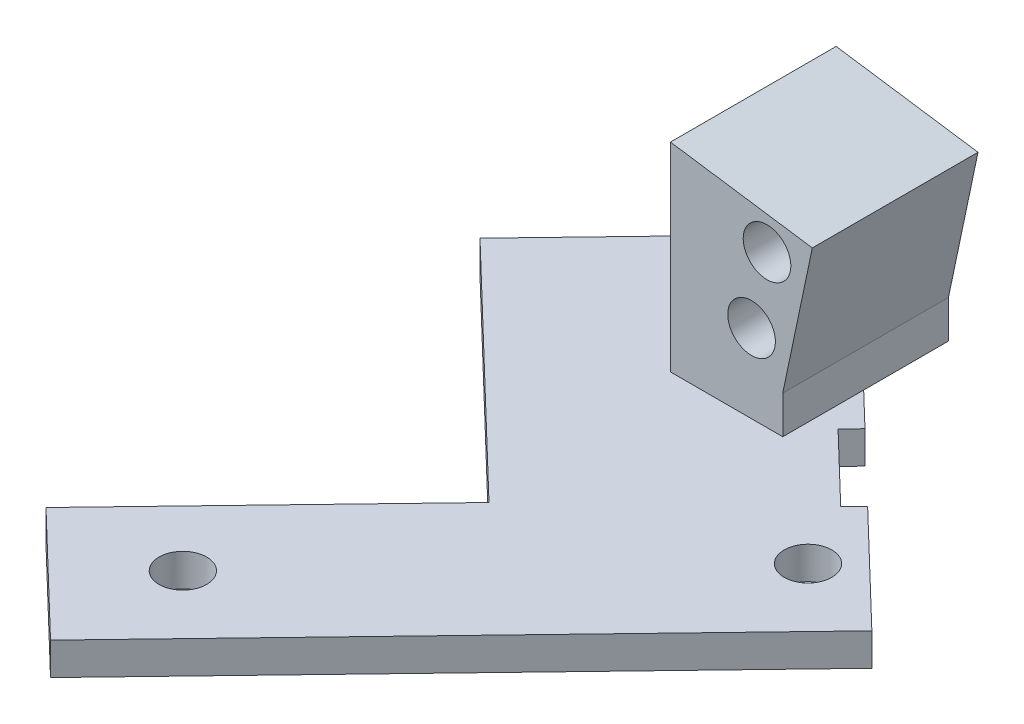
ISO-10303-21;
HEADER;
FILE_DESCRIPTION(('STEP AP214'),'2;1');
FILE_NAME('part.step','',(''),(''),'','','');
FILE_SCHEMA(('AUTOMOTIVE_DESIGN { 1 0 10303 214 1 1 1 1 }'));
ENDSEC;
DATA;
#1=APPLICATION_CONTEXT('core data for automotive mechanical design processes');
#2=APPLICATION_PROTOCOL_DEFINITION('international standard','automotive_design',2000,#1);
#3=PRODUCT_CONTEXT('',#1,'mechanical');
#4=PRODUCT('Part','Part','',(#3));
#5=PRODUCT_RELATED_PRODUCT_CATEGORY('part','',(#4));
#6=PRODUCT_DEFINITION_FORMATION('','',#4);
#7=PRODUCT_DEFINITION_CONTEXT('part definition',#1,'design');
#8=PRODUCT_DEFINITION('design','',#6,#7);
#9=PRODUCT_DEFINITION_SHAPE('','',#8);
#10=(LENGTH_UNIT() NAMED_UNIT(*) SI_UNIT(.MILLI.,.METRE.));
#11=(NAMED_UNIT(*) PLANE_ANGLE_UNIT() SI_UNIT($,.RADIAN.));
#12=(NAMED_UNIT(*) SI_UNIT($,.STERADIAN.) SOLID_ANGLE_UNIT());
#13=UNCERTAINTY_MEASURE_WITH_UNIT(LENGTH_MEASURE(1.E-05),#10,'distance_accuracy_value','');
#14=(GEOMETRIC_REPRESENTATION_CONTEXT(3) GLOBAL_UNCERTAINTY_ASSIGNED_CONTEXT((#13)) GLOBAL_UNIT_ASSIGNED_CONTEXT((#10,
#11,#12)) REPRESENTATION_CONTEXT('',''));
#15=CARTESIAN_POINT('',(0.,0.,0.));
#16=DIRECTION('',(0.,0.,1.));
#17=DIRECTION('',(1.,0.,0.));
#18=AXIS2_PLACEMENT_3D('',#15,#16,#17);
#19=CARTESIAN_POINT('',(-604.598546014192,76.8442272365331,38.5685199391407));
#20=DIRECTION('',(0.693078702824346,0.,-0.720861922764215));
#21=DIRECTION('',(-0.720861922764215,0.,-0.693078702824346));
#22=AXIS2_PLACEMENT_3D('',#19,#20,#21);
#23=PLANE('',#22);
#24=DIRECTION('',(0.,1.,0.));
#25=VECTOR('',#24,1.);
#26=CARTESIAN_POINT('',(-619.246460284761,200.405999999999,24.4851606977501));
#27=LINE('',#26,#25);
#28=CARTESIAN_POINT('',(-619.246460284761,200.405999999999,24.4851606977501));
#29=VERTEX_POINT('',#28);
#30=CARTESIAN_POINT('',(-619.246460284761,204.732760244927,24.4851606977501));
#31=VERTEX_POINT('',#30);
#32=EDGE_CURVE('E392',#29,#31,#27,.T.);
#33=ORIENTED_EDGE('',*,*,#32,.T.);
#34=DIRECTION('',(-0.720861922764215,0.,-0.693078702824346));
#35=VECTOR('',#34,1.);
#36=CARTESIAN_POINT('',(-604.598546014192,204.732760244927,38.5685199391409));
#37=LINE('',#36,#35);
#38=CARTESIAN_POINT('',(-604.598546014192,204.732760244927,38.5685199391409));
#39=VERTEX_POINT('',#38);
#40=EDGE_CURVE('E350',#39,#31,#37,.T.);
#41=ORIENTED_EDGE('',*,*,#40,.F.);
#42=DIRECTION('',(0.,1.,0.));
#43=VECTOR('',#42,1.);
#44=CARTESIAN_POINT('',(-604.598546014192,76.8442272365331,38.5685199391407));
#45=LINE('',#44,#43);
#46=CARTESIAN_POINT('',(-604.598546014192,200.405999999999,38.5685199391407));
#47=VERTEX_POINT('',#46);
#48=EDGE_CURVE('E190',#47,#39,#45,.T.);
#49=ORIENTED_EDGE('',*,*,#48,.F.);
#50=DIRECTION('',(-0.720861922764215,0.,-0.693078702824346));
#51=VECTOR('',#50,1.);
#52=CARTESIAN_POINT('',(-604.598546014193,200.405999999999,38.5685199391409));
#53=LINE('',#52,#51);
#54=EDGE_CURVE('E177',#47,#29,#53,.T.);
#55=ORIENTED_EDGE('',*,*,#54,.T.);
#56=EDGE_LOOP('',(#33,#41,#49,#55));
#57=FACE_BOUND('',#56,.T.);
#58=ADVANCED_FACE('F39',(#57),#23,.T.);
#59=CARTESIAN_POINT('',(-2.82777425332852E-13,204.732760244928,2.94113031765479E-13));
#60=DIRECTION('',(0.,1.,0.));
#61=DIRECTION('',(0.,0.,1.));
#62=AXIS2_PLACEMENT_3D('',#59,#60,#61);
#63=PLANE('',#62);
#64=DIRECTION('',(0.693078702824294,0.,-0.720861922764266));
#65=VECTOR('',#64,1.);
#66=CARTESIAN_POINT('',(-619.246460284761,204.732760244927,24.4851606977501));
#67=LINE('',#66,#65);
#68=CARTESIAN_POINT('',(-621.006880189935,204.732760244927,26.3161499815714));
#69=VERTEX_POINT('',#68);
#70=EDGE_CURVE('E159',#69,#31,#67,.T.);
#71=ORIENTED_EDGE('',*,*,#70,.F.);
#72=DIRECTION('',(0.720861922764211,0.,0.693078702824351));
#73=VECTOR('',#72,1.);
#74=CARTESIAN_POINT('',(-621.006880189935,204.732760244927,26.3161499815714));
#75=LINE('',#74,#73);
#76=CARTESIAN_POINT('',(-630.161826609041,204.732760244927,17.514050455702));
#77=VERTEX_POINT('',#76);
#78=EDGE_CURVE('E420',#77,#69,#75,.T.);
#79=ORIENTED_EDGE('',*,*,#78,.F.);
#80=DIRECTION('',(-0.693078702824283,0.,0.720861922764276));
#81=VECTOR('',#80,1.);
#82=CARTESIAN_POINT('',(-630.161826609041,204.732760244927,17.514050455702));
#83=LINE('',#82,#81);
#84=CARTESIAN_POINT('',(-628.401406703867,204.732760244927,15.6830611718808));
#85=VERTEX_POINT('',#84);
#86=EDGE_CURVE('E418',#85,#77,#83,.T.);
#87=ORIENTED_EDGE('',*,*,#86,.F.);
#88=CARTESIAN_POINT('',(-632.951817258194,204.732760244927,11.3080310243357));
#89=VERTEX_POINT('',#88);
#90=EDGE_CURVE('E168',#85,#89,#37,.T.);
#91=ORIENTED_EDGE('',*,*,#90,.T.);
#92=DIRECTION('',(0.,0.,-1.));
#93=VECTOR('',#92,1.);
#94=CARTESIAN_POINT('',(-632.951817258194,204.732760244928,22.0979999999997));
#95=LINE('',#94,#93);
#96=CARTESIAN_POINT('',(-632.951817258194,204.732760244927,22.0979999999998));
#97=VERTEX_POINT('',#96);
#98=EDGE_CURVE('E407',#97,#89,#95,.T.);
#99=ORIENTED_EDGE('',*,*,#98,.F.);
#100=DIRECTION('',(1.,0.,0.));
#101=VECTOR('',#100,1.);
#102=CARTESIAN_POINT('',(-602.012710946733,204.732760244927,22.0979999999998));
#103=LINE('',#102,#101);
#104=CARTESIAN_POINT('',(-647.929135226986,204.732760244927,22.0979999999998));
#105=VERTEX_POINT('',#104);
#106=EDGE_CURVE('E203',#105,#97,#103,.T.);
#107=ORIENTED_EDGE('',*,*,#106,.F.);
#108=DIRECTION('',(0.,0.,1.));
#109=VECTOR('',#108,1.);
#110=CARTESIAN_POINT('',(-647.929135226986,204.732760244927,-17.7800000000002));
#111=LINE('',#110,#109);
#112=CARTESIAN_POINT('',(-647.929135226986,204.732760244927,0.));
#113=VERTEX_POINT('',#112);
#114=EDGE_CURVE('E397',#113,#105,#111,.T.);
#115=ORIENTED_EDGE('',*,*,#114,.F.);
#116=DIRECTION('',(-1.,0.,0.));
#117=VECTOR('',#116,1.);
#118=CARTESIAN_POINT('',(-2.82777425332852E-13,204.732760244928,0.));
#119=LINE('',#118,#117);
#120=CARTESIAN_POINT('',(-644.713149634534,204.732760244927,0.));
#121=VERTEX_POINT('',#120);
#122=EDGE_CURVE('E205',#121,#113,#119,.T.);
#123=ORIENTED_EDGE('',*,*,#122,.F.);
#124=CARTESIAN_POINT('',(-651.343308244833,204.732760244927,-6.37462124719411));
#125=VERTEX_POINT('',#124);
#126=EDGE_CURVE('E339',#121,#125,#37,.T.);
#127=ORIENTED_EDGE('',*,*,#126,.T.);
#128=DIRECTION('',(-0.693078702824347,0.,0.720861922764215));
#129=VECTOR('',#128,1.);
#130=CARTESIAN_POINT('',(-651.343308244833,204.732760244927,-6.37462124719411));
#131=LINE('',#130,#129);
#132=CARTESIAN_POINT('',(-676.077405688726,204.732760244927,19.3509838948822));
#133=VERTEX_POINT('',#132);
#134=EDGE_CURVE('E337',#125,#133,#131,.T.);
#135=ORIENTED_EDGE('',*,*,#134,.T.);
#136=DIRECTION('',(0.720861922764215,0.,0.693078702824346));
#137=VECTOR('',#136,1.);
#138=CARTESIAN_POINT('',(-676.077405688726,204.732760244927,19.3509838948822));
#139=LINE('',#138,#137);
#140=CARTESIAN_POINT('',(-644.950587863767,204.732760244927,49.2781222828375));
#141=VERTEX_POINT('',#140);
#142=EDGE_CURVE('E335',#133,#141,#139,.T.);
#143=ORIENTED_EDGE('',*,*,#142,.T.);
#144=DIRECTION('',(-0.693078702824349,0.,0.720861922764213));
#145=VECTOR('',#144,1.);
#146=CARTESIAN_POINT('',(-644.950587863767,204.732760244927,49.2781222828375));
#147=LINE('',#146,#145);
#148=CARTESIAN_POINT('',(-673.909297527677,204.732760244927,79.3976902973048));
#149=VERTEX_POINT('',#148);
#150=EDGE_CURVE('E323',#141,#149,#147,.T.);
#151=ORIENTED_EDGE('',*,*,#150,.T.);
#152=DIRECTION('',(0.720861922764215,0.,0.693078702824347));
#153=VECTOR('',#152,1.);
#154=CARTESIAN_POINT('',(-673.909297527677,204.732760244927,79.3976902973048));
#155=LINE('',#154,#153);
#156=CARTESIAN_POINT('',(-658.291353121995,204.732760244927,94.4136930956845));
#157=VERTEX_POINT('',#156);
#158=EDGE_CURVE('E318',#149,#157,#155,.T.);
#159=ORIENTED_EDGE('',*,*,#158,.T.);
#160=DIRECTION('',(0.693078702824348,0.,-0.720861922764214));
#161=VECTOR('',#160,1.);
#162=CARTESIAN_POINT('',(-658.291353121995,204.732760244927,94.4136930956845));
#163=LINE('',#162,#161);
#164=EDGE_CURVE('E343',#157,#39,#163,.T.);
#165=ORIENTED_EDGE('',*,*,#164,.T.);
#166=ORIENTED_EDGE('',*,*,#40,.T.);
#167=EDGE_LOOP('',(#71,#79,#87,#91,#99,#107,#115,#123,#127,#135,#143,#151,#159,#165,#166));
#168=FACE_BOUND('',#167,.T.);
#169=CARTESIAN_POINT('',(-657.48441081386,204.732760244927,77.5717361432777));
#170=DIRECTION('',(0.,1.,0.));
#171=DIRECTION('',(0.,0.,1.));
#172=AXIS2_PLACEMENT_3D('',#169,#170,#171);
#173=CIRCLE('',#172,3.17499999999997);
#174=CARTESIAN_POINT('',(-657.48441081386,204.732760244927,80.7467361432777));
#175=VERTEX_POINT('',#174);
#176=EDGE_CURVE('E199',#175,#175,#173,.T.);
#177=ORIENTED_EDGE('',*,*,#176,.F.);
#178=EDGE_LOOP('',(#177));
#179=FACE_BOUND('',#178,.T.);
#180=CARTESIAN_POINT('',(-616.617520158039,204.732760244927,35.0666277688599));
#181=DIRECTION('',(0.,1.,0.));
#182=DIRECTION('',(0.,0.,1.));
#183=AXIS2_PLACEMENT_3D('',#180,#181,#182);
#184=CIRCLE('',#183,3.17500000000008);
#185=CARTESIAN_POINT('',(-616.617520158039,204.732760244927,38.2416277688599));
#186=VERTEX_POINT('',#185);
#187=EDGE_CURVE('E371',#186,#186,#184,.T.);
#188=ORIENTED_EDGE('',*,*,#187,.F.);
#189=EDGE_LOOP('',(#188));
#190=FACE_BOUND('',#189,.T.);
#191=ADVANCED_FACE('F240',(#168,#179,#190),#63,.T.);
#192=CARTESIAN_POINT('',(0.,0.,0.));
#193=DIRECTION('',(0.,0.,1.));
#194=DIRECTION('',(1.,0.,0.));
#195=AXIS2_PLACEMENT_3D('',#192,#193,#194);
#196=PLANE('',#195);
#197=ORIENTED_EDGE('',*,*,#122,.T.);
#198=DIRECTION('',(0.,1.,0.));
#199=VECTOR('',#198,1.);
#200=CARTESIAN_POINT('',(-647.929135226986,2.70956274810052E-12,0.));
#201=LINE('',#200,#199);
#202=CARTESIAN_POINT('',(-647.929135226985,231.281170860579,0.));
#203=VERTEX_POINT('',#202);
#204=EDGE_CURVE('E405',#113,#203,#201,.T.);
#205=ORIENTED_EDGE('',*,*,#204,.T.);
#206=DIRECTION('',(-0.989476406877661,0.144694299239717,0.));
#207=VECTOR('',#206,1.);
#208=CARTESIAN_POINT('',(-629.011320926215,228.514758377805,0.));
#209=LINE('',#208,#207);
#210=CARTESIAN_POINT('',(-629.011320926215,228.514758377805,0.));
#211=VERTEX_POINT('',#210);
#212=EDGE_CURVE('E329',#211,#203,#209,.T.);
#213=ORIENTED_EDGE('',*,*,#212,.F.);
#214=DIRECTION('',(0.205752852606502,0.978603987138969,0.));
#215=VECTOR('',#214,1.);
#216=CARTESIAN_POINT('',(-632.951817258193,209.772926257714,0.));
#217=LINE('',#216,#215);
#218=CARTESIAN_POINT('',(-632.951817258193,209.772926257714,0.));
#219=VERTEX_POINT('',#218);
#220=EDGE_CURVE('E210',#219,#211,#217,.T.);
#221=ORIENTED_EDGE('',*,*,#220,.F.);
#222=DIRECTION('',(0.,-1.,0.));
#223=VECTOR('',#222,1.);
#224=CARTESIAN_POINT('',(-632.951817258194,232.176381810683,0.));
#225=LINE('',#224,#223);
#226=CARTESIAN_POINT('',(-632.951817258194,204.732760244928,0.));
#227=VERTEX_POINT('',#226);
#228=EDGE_CURVE('E355',#219,#227,#225,.T.);
#229=ORIENTED_EDGE('',*,*,#228,.T.);
#230=DIRECTION('',(-1.,1.78628855781348E-13,0.));
#231=VECTOR('',#230,1.);
#232=CARTESIAN_POINT('',(-644.129361835329,204.732760244927,0.));
#233=LINE('',#232,#231);
#234=EDGE_CURVE('E346',#227,#121,#233,.T.);
#235=ORIENTED_EDGE('',*,*,#234,.T.);
#236=EDGE_LOOP('',(#197,#205,#213,#221,#229,#235));
#237=FACE_BOUND('',#236,.T.);
#238=CARTESIAN_POINT('',(-635.053635704384,224.999999999999,0.));
#239=DIRECTION('',(0.,0.,1.));
#240=DIRECTION('',(1.,0.,0.));
#241=AXIS2_PLACEMENT_3D('',#238,#239,#240);
#242=CIRCLE('',#241,3.1750000000002);
#243=CARTESIAN_POINT('',(-638.228635704384,224.999999999999,0.));
#244=VERTEX_POINT('',#243);
#245=EDGE_CURVE('E209',#244,#244,#242,.T.);
#246=ORIENTED_EDGE('',*,*,#245,.T.);
#247=EDGE_LOOP('',(#246));
#248=FACE_BOUND('',#247,.T.);
#249=CARTESIAN_POINT('',(-637.111164230449,215.21396012861,0.));
#250=DIRECTION('',(0.,0.,1.));
#251=DIRECTION('',(1.,0.,0.));
#252=AXIS2_PLACEMENT_3D('',#249,#250,#251);
#253=CIRCLE('',#252,3.17500000000009);
#254=CARTESIAN_POINT('',(-640.286164230449,215.21396012861,0.));
#255=VERTEX_POINT('',#254);
#256=EDGE_CURVE('E217',#255,#255,#253,.T.);
#257=ORIENTED_EDGE('',*,*,#256,.T.);
#258=EDGE_LOOP('',(#257));
#259=FACE_BOUND('',#258,.T.);
#260=ADVANCED_FACE('F237',(#237,#248,#259),#196,.F.);
#261=CARTESIAN_POINT('',(-632.951817258193,209.772926257714,53.0414259923048));
#262=DIRECTION('',(-0.978603987138969,0.205752852606502,0.));
#263=DIRECTION('',(-0.205752852606502,-0.978603987138969,0.));
#264=AXIS2_PLACEMENT_3D('',#261,#262,#263);
#265=PLANE('',#264);
#266=DIRECTION('',(0.,0.,-1.));
#267=VECTOR('',#266,1.);
#268=CARTESIAN_POINT('',(-629.011320926215,228.514758377805,53.0414259923048));
#269=LINE('',#268,#267);
#270=CARTESIAN_POINT('',(-629.011320926215,228.514758377805,22.0979999999998));
#271=VERTEX_POINT('',#270);
#272=EDGE_CURVE('E213',#271,#211,#269,.T.);
#273=ORIENTED_EDGE('',*,*,#272,.F.);
#274=DIRECTION('',(-0.205752852606502,-0.978603987138969,0.));
#275=VECTOR('',#274,1.);
#276=CARTESIAN_POINT('',(-632.951817258193,209.772926257714,22.0979999999998));
#277=LINE('',#276,#275);
#278=CARTESIAN_POINT('',(-632.951817258193,209.772926257714,22.0979999999998));
#279=VERTEX_POINT('',#278);
#280=EDGE_CURVE('E220',#271,#279,#277,.T.);
#281=ORIENTED_EDGE('',*,*,#280,.T.);
#282=DIRECTION('',(0.,0.,-1.));
#283=VECTOR('',#282,1.);
#284=CARTESIAN_POINT('',(-632.951817258193,209.772926257714,53.0414259923048));
#285=LINE('',#284,#283);
#286=EDGE_CURVE('E214',#279,#219,#285,.T.);
#287=ORIENTED_EDGE('',*,*,#286,.T.);
#288=ORIENTED_EDGE('',*,*,#220,.T.);
#289=EDGE_LOOP('',(#273,#281,#287,#288));
#290=FACE_BOUND('',#289,.T.);
#291=ADVANCED_FACE('F239',(#290),#265,.F.);
#292=CARTESIAN_POINT('',(-635.053635704384,224.999999999999,53.0414259923048));
#293=DIRECTION('',(0.,0.,-1.));
#294=DIRECTION('',(-1.,0.,0.));
#295=AXIS2_PLACEMENT_3D('',#292,#293,#294);
#296=CYLINDRICAL_SURFACE('',#295,3.1750000000002);
#297=CARTESIAN_POINT('',(-635.053635704384,224.999999999999,22.0979999999998));
#298=DIRECTION('',(0.,0.,-1.));
#299=DIRECTION('',(-1.,0.,0.));
#300=AXIS2_PLACEMENT_3D('',#297,#298,#299);
#301=CIRCLE('',#300,3.1750000000002);
#302=CARTESIAN_POINT('',(-638.228635704384,224.999999999999,22.0979999999998));
#303=VERTEX_POINT('',#302);
#304=EDGE_CURVE('E47',#303,#303,#301,.T.);
#305=CARTESIAN_POINT('',(-638.228635704384,224.999999999999,22.0979999999998));
#306=CARTESIAN_POINT('',(-638.228635704384,224.999999999999,21.8678124999998));
#307=CARTESIAN_POINT('',(-638.228635704384,224.999999999999,21.6376249999998));
#308=CARTESIAN_POINT('',(-638.228635704384,224.999999999999,21.1772499999998));
#309=CARTESIAN_POINT('',(-638.228635704384,224.999999999999,20.9470624999998));
#310=CARTESIAN_POINT('',(-638.228635704384,224.999999999999,20.4866874999998));
#311=CARTESIAN_POINT('',(-638.228635704384,224.999999999999,20.2564999999998));
#312=CARTESIAN_POINT('',(-638.228635704384,224.999999999999,19.7961249999998));
#313=CARTESIAN_POINT('',(-638.228635704384,224.999999999999,19.5659374999998));
#314=CARTESIAN_POINT('',(-638.228635704384,224.999999999999,19.1055624999998));
#315=CARTESIAN_POINT('',(-638.228635704384,224.999999999999,18.8753749999998));
#316=CARTESIAN_POINT('',(-638.228635704384,224.999999999999,18.4149999999998));
#317=CARTESIAN_POINT('',(-638.228635704384,224.999999999999,18.1848124999998));
#318=CARTESIAN_POINT('',(-638.228635704384,224.999999999999,17.7244374999998));
#319=CARTESIAN_POINT('',(-638.228635704384,224.999999999999,17.4942499999998));
#320=CARTESIAN_POINT('',(-638.228635704384,224.999999999999,17.0338749999998));
#321=CARTESIAN_POINT('',(-638.228635704384,224.999999999999,16.8036874999998));
#322=CARTESIAN_POINT('',(-638.228635704384,224.999999999999,16.3433124999998));
#323=CARTESIAN_POINT('',(-638.228635704384,224.999999999999,16.1131249999998));
#324=CARTESIAN_POINT('',(-638.228635704384,224.999999999999,15.6527499999998));
#325=CARTESIAN_POINT('',(-638.228635704384,224.999999999999,15.4225624999998));
#326=CARTESIAN_POINT('',(-638.228635704384,224.999999999999,14.9621874999998));
#327=CARTESIAN_POINT('',(-638.228635704384,224.999999999999,14.7319999999998));
#328=CARTESIAN_POINT('',(-638.228635704384,224.999999999999,14.2716249999998));
#329=CARTESIAN_POINT('',(-638.228635704384,224.999999999999,14.0414374999998));
#330=CARTESIAN_POINT('',(-638.228635704384,224.999999999999,13.5810624999998));
#331=CARTESIAN_POINT('',(-638.228635704384,224.999999999999,13.3508749999999));
#332=CARTESIAN_POINT('',(-638.228635704384,224.999999999999,12.8904999999999));
#333=CARTESIAN_POINT('',(-638.228635704384,224.999999999999,12.6603124999999));
#334=CARTESIAN_POINT('',(-638.228635704384,224.999999999999,12.1999374999999));
#335=CARTESIAN_POINT('',(-638.228635704384,224.999999999999,11.9697499999999));
#336=CARTESIAN_POINT('',(-638.228635704384,224.999999999999,11.5093749999999));
#337=CARTESIAN_POINT('',(-638.228635704384,224.999999999999,11.2791874999999));
#338=CARTESIAN_POINT('',(-638.228635704384,224.999999999999,10.8188124999999));
#339=CARTESIAN_POINT('',(-638.228635704384,224.999999999999,10.5886249999999));
#340=CARTESIAN_POINT('',(-638.228635704384,224.999999999999,10.1282499999999));
#341=CARTESIAN_POINT('',(-638.228635704384,224.999999999999,9.89806249999989));
#342=CARTESIAN_POINT('',(-638.228635704384,224.999999999999,9.4376874999999));
#343=CARTESIAN_POINT('',(-638.228635704384,224.999999999999,9.2074999999999));
#344=CARTESIAN_POINT('',(-638.228635704384,224.999999999999,8.74712499999991));
#345=CARTESIAN_POINT('',(-638.228635704384,224.999999999999,8.51693749999991));
#346=CARTESIAN_POINT('',(-638.228635704384,224.999999999999,8.05656249999991));
#347=CARTESIAN_POINT('',(-638.228635704384,224.999999999999,7.82637499999992));
#348=CARTESIAN_POINT('',(-638.228635704384,224.999999999999,7.36599999999992));
#349=CARTESIAN_POINT('',(-638.228635704384,224.999999999999,7.13581249999992));
#350=CARTESIAN_POINT('',(-638.228635704384,224.999999999999,6.67543749999993));
#351=CARTESIAN_POINT('',(-638.228635704384,224.999999999999,6.44524999999993));
#352=CARTESIAN_POINT('',(-638.228635704384,224.999999999999,5.98487499999993));
#353=CARTESIAN_POINT('',(-638.228635704384,224.999999999999,5.75468749999994));
#354=CARTESIAN_POINT('',(-638.228635704384,224.999999999999,5.29431249999994));
#355=CARTESIAN_POINT('',(-638.228635704384,224.999999999999,5.06412499999994));
#356=CARTESIAN_POINT('',(-638.228635704384,224.999999999999,4.60374999999995));
#357=CARTESIAN_POINT('',(-638.228635704384,224.999999999999,4.37356249999995));
#358=CARTESIAN_POINT('',(-638.228635704384,224.999999999999,3.91318749999996));
#359=CARTESIAN_POINT('',(-638.228635704384,224.999999999999,3.68299999999996));
#360=CARTESIAN_POINT('',(-638.228635704384,224.999999999999,3.22262499999996));
#361=CARTESIAN_POINT('',(-638.228635704384,224.999999999999,2.99243749999996));
#362=CARTESIAN_POINT('',(-638.228635704384,224.999999999999,2.53206249999997));
#363=CARTESIAN_POINT('',(-638.228635704384,224.999999999999,2.30187499999997));
#364=CARTESIAN_POINT('',(-638.228635704384,224.999999999999,1.84149999999998));
#365=CARTESIAN_POINT('',(-638.228635704384,224.999999999999,1.61131249999998));
#366=CARTESIAN_POINT('',(-638.228635704384,224.999999999999,1.15093749999999));
#367=CARTESIAN_POINT('',(-638.228635704384,224.999999999999,0.920749999999989));
#368=CARTESIAN_POINT('',(-638.228635704384,224.999999999999,0.460374999999994));
#369=CARTESIAN_POINT('',(-638.228635704384,224.999999999999,0.230187499999997));
#370=CARTESIAN_POINT('',(-638.228635704384,224.999999999999,0.));
#371=B_SPLINE_CURVE_WITH_KNOTS('',3,(#305,#306,#307,#308,#309,#310,#311,#312,#313,#314,#315,
#316,#317,#318,#319,#320,#321,#322,#323,#324,#325,#326,#327,#328,#329,#330,#331,#332,#333,#334,
#335,#336,#337,#338,#339,#340,#341,#342,#343,#344,#345,#346,#347,#348,#349,#350,#351,#352,#353,
#354,#355,#356,#357,#358,#359,#360,#361,#362,#363,#364,#365,#366,#367,#368,#369,#370),
.UNSPECIFIED.,.F.,.F.,(4,2,2,2,2,2,2,2,2,2,2,2,2,2,2,2,2,2,2,2,2,2,2,2,2,2,2,2,2,2,2,2,4),(0.,
0.690562499999988,1.38112499999998,2.07168749999997,2.76224999999996,3.45281249999996,
4.14337499999995,4.83393749999994,5.52449999999994,6.21506249999993,6.90562499999992,
7.59618749999991,8.28674999999991,8.9773124999999,9.66787499999989,10.3584374999999,
11.0489999999999,11.7395624999999,12.4301249999999,13.1206874999998,13.8112499999998,
14.5018124999998,15.1923749999998,15.8829374999998,16.5734999999998,17.2640624999998,
17.9546249999998,18.6451874999998,19.3357499999998,20.0263124999998,20.7168749999998,
21.4074374999998,22.0979999999998),.UNSPECIFIED.);
#372=EDGE_CURVE('BSEAM234',#303,#244,#371,.T.);
#373=ORIENTED_EDGE('',*,*,#304,.F.);
#374=ORIENTED_EDGE('',*,*,#245,.F.);
#375=ORIENTED_EDGE('',*,*,#372,.T.);
#376=ORIENTED_EDGE('',*,*,#372,.F.);
#377=EDGE_LOOP('',(#373,#375,#374,#376));
#378=FACE_BOUND('',#377,.T.);
#379=ADVANCED_FACE('F234',(#378),#296,.F.);
#380=CARTESIAN_POINT('',(-637.111164230449,215.21396012861,53.0414259923048));
#381=DIRECTION('',(0.,0.,-1.));
#382=DIRECTION('',(-1.,0.,0.));
#383=AXIS2_PLACEMENT_3D('',#380,#381,#382);
#384=CYLINDRICAL_SURFACE('',#383,3.17500000000009);
#385=CARTESIAN_POINT('',(-637.111164230449,215.21396012861,22.0979999999998));
#386=DIRECTION('',(0.,0.,-1.));
#387=DIRECTION('',(-1.,0.,0.));
#388=AXIS2_PLACEMENT_3D('',#385,#386,#387);
#389=CIRCLE('',#388,3.17500000000009);
#390=CARTESIAN_POINT('',(-640.286164230449,215.21396012861,22.0979999999998));
#391=VERTEX_POINT('',#390);
#392=EDGE_CURVE('E222',#391,#391,#389,.T.);
#393=CARTESIAN_POINT('',(-640.286164230449,215.21396012861,22.0979999999998));
#394=CARTESIAN_POINT('',(-640.286164230449,215.21396012861,21.8678124999998));
#395=CARTESIAN_POINT('',(-640.286164230449,215.21396012861,21.6376249999998));
#396=CARTESIAN_POINT('',(-640.286164230449,215.21396012861,21.1772499999998));
#397=CARTESIAN_POINT('',(-640.286164230449,215.21396012861,20.9470624999998));
#398=CARTESIAN_POINT('',(-640.286164230449,215.21396012861,20.4866874999998));
#399=CARTESIAN_POINT('',(-640.286164230449,215.21396012861,20.2564999999998));
#400=CARTESIAN_POINT('',(-640.286164230449,215.21396012861,19.7961249999998));
#401=CARTESIAN_POINT('',(-640.286164230449,215.21396012861,19.5659374999998));
#402=CARTESIAN_POINT('',(-640.286164230449,215.21396012861,19.1055624999998));
#403=CARTESIAN_POINT('',(-640.286164230449,215.21396012861,18.8753749999998));
#404=CARTESIAN_POINT('',(-640.286164230449,215.21396012861,18.4149999999998));
#405=CARTESIAN_POINT('',(-640.286164230449,215.21396012861,18.1848124999998));
#406=CARTESIAN_POINT('',(-640.286164230449,215.21396012861,17.7244374999998));
#407=CARTESIAN_POINT('',(-640.286164230449,215.21396012861,17.4942499999998));
#408=CARTESIAN_POINT('',(-640.286164230449,215.21396012861,17.0338749999998));
#409=CARTESIAN_POINT('',(-640.286164230449,215.21396012861,16.8036874999998));
#410=CARTESIAN_POINT('',(-640.286164230449,215.21396012861,16.3433124999998));
#411=CARTESIAN_POINT('',(-640.286164230449,215.21396012861,16.1131249999998));
#412=CARTESIAN_POINT('',(-640.286164230449,215.21396012861,15.6527499999998));
#413=CARTESIAN_POINT('',(-640.286164230449,215.21396012861,15.4225624999998));
#414=CARTESIAN_POINT('',(-640.286164230449,215.21396012861,14.9621874999998));
#415=CARTESIAN_POINT('',(-640.286164230449,215.21396012861,14.7319999999998));
#416=CARTESIAN_POINT('',(-640.286164230449,215.21396012861,14.2716249999998));
#417=CARTESIAN_POINT('',(-640.286164230449,215.21396012861,14.0414374999998));
#418=CARTESIAN_POINT('',(-640.286164230449,215.21396012861,13.5810624999998));
#419=CARTESIAN_POINT('',(-640.286164230449,215.21396012861,13.3508749999999));
#420=CARTESIAN_POINT('',(-640.286164230449,215.21396012861,12.8904999999999));
#421=CARTESIAN_POINT('',(-640.286164230449,215.21396012861,12.6603124999999));
#422=CARTESIAN_POINT('',(-640.286164230449,215.21396012861,12.1999374999999));
#423=CARTESIAN_POINT('',(-640.286164230449,215.21396012861,11.9697499999999));
#424=CARTESIAN_POINT('',(-640.286164230449,215.21396012861,11.5093749999999));
#425=CARTESIAN_POINT('',(-640.286164230449,215.21396012861,11.2791874999999));
#426=CARTESIAN_POINT('',(-640.286164230449,215.21396012861,10.8188124999999));
#427=CARTESIAN_POINT('',(-640.286164230449,215.21396012861,10.5886249999999));
#428=CARTESIAN_POINT('',(-640.286164230449,215.21396012861,10.1282499999999));
#429=CARTESIAN_POINT('',(-640.286164230449,215.21396012861,9.89806249999989));
#430=CARTESIAN_POINT('',(-640.286164230449,215.21396012861,9.4376874999999));
#431=CARTESIAN_POINT('',(-640.286164230449,215.21396012861,9.2074999999999));
#432=CARTESIAN_POINT('',(-640.286164230449,215.21396012861,8.74712499999991));
#433=CARTESIAN_POINT('',(-640.286164230449,215.21396012861,8.51693749999991));
#434=CARTESIAN_POINT('',(-640.286164230449,215.21396012861,8.05656249999991));
#435=CARTESIAN_POINT('',(-640.286164230449,215.21396012861,7.82637499999992));
#436=CARTESIAN_POINT('',(-640.286164230449,215.21396012861,7.36599999999992));
#437=CARTESIAN_POINT('',(-640.286164230449,215.21396012861,7.13581249999992));
#438=CARTESIAN_POINT('',(-640.286164230449,215.21396012861,6.67543749999993));
#439=CARTESIAN_POINT('',(-640.286164230449,215.21396012861,6.44524999999993));
#440=CARTESIAN_POINT('',(-640.286164230449,215.21396012861,5.98487499999993));
#441=CARTESIAN_POINT('',(-640.286164230449,215.21396012861,5.75468749999994));
#442=CARTESIAN_POINT('',(-640.286164230449,215.21396012861,5.29431249999994));
#443=CARTESIAN_POINT('',(-640.286164230449,215.21396012861,5.06412499999994));
#444=CARTESIAN_POINT('',(-640.286164230449,215.21396012861,4.60374999999995));
#445=CARTESIAN_POINT('',(-640.286164230449,215.21396012861,4.37356249999995));
#446=CARTESIAN_POINT('',(-640.286164230449,215.21396012861,3.91318749999996));
#447=CARTESIAN_POINT('',(-640.286164230449,215.21396012861,3.68299999999996));
#448=CARTESIAN_POINT('',(-640.286164230449,215.21396012861,3.22262499999996));
#449=CARTESIAN_POINT('',(-640.286164230449,215.21396012861,2.99243749999996));
#450=CARTESIAN_POINT('',(-640.286164230449,215.21396012861,2.53206249999997));
#451=CARTESIAN_POINT('',(-640.286164230449,215.21396012861,2.30187499999997));
#452=CARTESIAN_POINT('',(-640.286164230449,215.21396012861,1.84149999999998));
#453=CARTESIAN_POINT('',(-640.286164230449,215.21396012861,1.61131249999998));
#454=CARTESIAN_POINT('',(-640.286164230449,215.21396012861,1.15093749999999));
#455=CARTESIAN_POINT('',(-640.286164230449,215.21396012861,0.920749999999989));
#456=CARTESIAN_POINT('',(-640.286164230449,215.21396012861,0.460374999999994));
#457=CARTESIAN_POINT('',(-640.286164230449,215.21396012861,0.230187499999997));
#458=CARTESIAN_POINT('',(-640.286164230449,215.21396012861,0.));
#459=B_SPLINE_CURVE_WITH_KNOTS('',3,(#393,#394,#395,#396,#397,#398,#399,#400,#401,#402,#403,
#404,#405,#406,#407,#408,#409,#410,#411,#412,#413,#414,#415,#416,#417,#418,#419,#420,#421,#422,
#423,#424,#425,#426,#427,#428,#429,#430,#431,#432,#433,#434,#435,#436,#437,#438,#439,#440,#441,
#442,#443,#444,#445,#446,#447,#448,#449,#450,#451,#452,#453,#454,#455,#456,#457,#458),
.UNSPECIFIED.,.F.,.F.,(4,2,2,2,2,2,2,2,2,2,2,2,2,2,2,2,2,2,2,2,2,2,2,2,2,2,2,2,2,2,2,2,4),(0.,
0.690562499999988,1.38112499999998,2.07168749999997,2.76224999999996,3.45281249999996,
4.14337499999995,4.83393749999994,5.52449999999994,6.21506249999993,6.90562499999992,
7.59618749999991,8.28674999999991,8.9773124999999,9.66787499999989,10.3584374999999,
11.0489999999999,11.7395624999999,12.4301249999999,13.1206874999998,13.8112499999998,
14.5018124999998,15.1923749999998,15.8829374999998,16.5734999999998,17.2640624999998,
17.9546249999998,18.6451874999998,19.3357499999998,20.0263124999998,20.7168749999998,
21.4074374999998,22.0979999999998),.UNSPECIFIED.);
#460=EDGE_CURVE('BSEAM231',#391,#255,#459,.T.);
#461=ORIENTED_EDGE('',*,*,#392,.F.);
#462=ORIENTED_EDGE('',*,*,#256,.F.);
#463=ORIENTED_EDGE('',*,*,#460,.T.);
#464=ORIENTED_EDGE('',*,*,#460,.F.);
#465=EDGE_LOOP('',(#461,#463,#462,#464));
#466=FACE_BOUND('',#465,.T.);
#467=ADVANCED_FACE('F231',(#466),#384,.F.);
#468=CARTESIAN_POINT('',(-602.012710946733,222.838262989788,22.0979999999998));
#469=DIRECTION('',(0.,0.,-1.));
#470=DIRECTION('',(-1.,0.,0.));
#471=AXIS2_PLACEMENT_3D('',#468,#469,#470);
#472=PLANE('',#471);
#473=ORIENTED_EDGE('',*,*,#392,.T.);
#474=EDGE_LOOP('',(#473));
#475=FACE_BOUND('',#474,.T.);
#476=ORIENTED_EDGE('',*,*,#304,.T.);
#477=EDGE_LOOP('',(#476));
#478=FACE_BOUND('',#477,.T.);
#479=DIRECTION('',(-0.989476406877661,0.144694299239717,0.));
#480=VECTOR('',#479,1.);
#481=CARTESIAN_POINT('',(-601.765252830471,224.530478709539,22.0979999999998));
#482=LINE('',#481,#480);
#483=CARTESIAN_POINT('',(-647.929135226985,231.281170860579,22.0979999999998));
#484=VERTEX_POINT('',#483);
#485=EDGE_CURVE('E326',#271,#484,#482,.T.);
#486=ORIENTED_EDGE('',*,*,#485,.T.);
#487=DIRECTION('',(0.,1.,0.));
#488=VECTOR('',#487,1.);
#489=CARTESIAN_POINT('',(-647.929135226985,231.281170860579,22.0979999999998));
#490=LINE('',#489,#488);
#491=EDGE_CURVE('E62',#105,#484,#490,.T.);
#492=ORIENTED_EDGE('',*,*,#491,.F.);
#493=ORIENTED_EDGE('',*,*,#106,.T.);
#494=DIRECTION('',(0.,-1.,0.));
#495=VECTOR('',#494,1.);
#496=CARTESIAN_POINT('',(-632.951817258194,232.176381810683,22.0979999999998));
#497=LINE('',#496,#495);
#498=EDGE_CURVE('E356',#279,#97,#497,.T.);
#499=ORIENTED_EDGE('',*,*,#498,.F.);
#500=ORIENTED_EDGE('',*,*,#280,.F.);
#501=EDGE_LOOP('',(#486,#492,#493,#499,#500));
#502=FACE_BOUND('',#501,.T.);
#503=ADVANCED_FACE('F41',(#475,#478,#502),#472,.F.);
#504=CARTESIAN_POINT('',(-644.950587863767,76.8442272365331,49.2781222828373));
#505=DIRECTION('',(-0.720861922764213,0.,-0.693078702824349));
#506=DIRECTION('',(-0.693078702824349,0.,0.720861922764213));
#507=AXIS2_PLACEMENT_3D('',#504,#505,#506);
#508=PLANE('',#507);
#509=DIRECTION('',(0.,1.,0.));
#510=VECTOR('',#509,1.);
#511=CARTESIAN_POINT('',(-644.950587863767,76.8442272365331,49.2781222828373));
#512=LINE('',#511,#510);
#513=CARTESIAN_POINT('',(-644.950587863767,200.405999999999,49.2781222828377));
#514=VERTEX_POINT('',#513);
#515=EDGE_CURVE('E191',#514,#141,#512,.T.);
#516=ORIENTED_EDGE('',*,*,#515,.F.);
#517=DIRECTION('',(-0.693078702824349,0.,0.720861922764213));
#518=VECTOR('',#517,1.);
#519=CARTESIAN_POINT('',(-644.950587863767,200.405999999999,49.2781222828375));
#520=LINE('',#519,#518);
#521=CARTESIAN_POINT('',(-673.909297527677,200.405999999999,79.3976902973049));
#522=VERTEX_POINT('',#521);
#523=EDGE_CURVE('E202',#514,#522,#520,.T.);
#524=ORIENTED_EDGE('',*,*,#523,.T.);
#525=DIRECTION('',(0.,1.,0.));
#526=VECTOR('',#525,1.);
#527=CARTESIAN_POINT('',(-673.909297527677,76.844227236533,79.3976902973046));
#528=LINE('',#527,#526);
#529=EDGE_CURVE('E200',#522,#149,#528,.T.);
#530=ORIENTED_EDGE('',*,*,#529,.T.);
#531=ORIENTED_EDGE('',*,*,#150,.F.);
#532=EDGE_LOOP('',(#516,#524,#530,#531));
#533=FACE_BOUND('',#532,.T.);
#534=ADVANCED_FACE('F280',(#533),#508,.T.);
#535=CARTESIAN_POINT('',(-676.077405688725,76.8442272365331,19.350983894882));
#536=DIRECTION('',(-0.693078702824346,0.,0.720861922764215));
#537=DIRECTION('',(0.720861922764215,0.,0.693078702824346));
#538=AXIS2_PLACEMENT_3D('',#535,#536,#537);
#539=PLANE('',#538);
#540=DIRECTION('',(0.,1.,0.));
#541=VECTOR('',#540,1.);
#542=CARTESIAN_POINT('',(-676.077405688725,76.8442272365331,19.350983894882));
#543=LINE('',#542,#541);
#544=CARTESIAN_POINT('',(-676.077405688726,200.405999999999,19.3509838948822));
#545=VERTEX_POINT('',#544);
#546=EDGE_CURVE('E178',#545,#133,#543,.T.);
#547=ORIENTED_EDGE('',*,*,#546,.F.);
#548=DIRECTION('',(0.720861922764215,0.,0.693078702824346));
#549=VECTOR('',#548,1.);
#550=CARTESIAN_POINT('',(-676.077405688726,200.405999999999,19.3509838948822));
#551=LINE('',#550,#549);
#552=EDGE_CURVE('E192',#545,#514,#551,.T.);
#553=ORIENTED_EDGE('',*,*,#552,.T.);
#554=ORIENTED_EDGE('',*,*,#515,.T.);
#555=ORIENTED_EDGE('',*,*,#142,.F.);
#556=EDGE_LOOP('',(#547,#553,#554,#555));
#557=FACE_BOUND('',#556,.T.);
#558=ADVANCED_FACE('F274',(#557),#539,.T.);
#559=CARTESIAN_POINT('',(-651.343308244833,76.8442272365331,-6.3746212471943));
#560=DIRECTION('',(-0.720861922764215,0.,-0.693078702824347));
#561=DIRECTION('',(-0.693078702824347,0.,0.720861922764215));
#562=AXIS2_PLACEMENT_3D('',#559,#560,#561);
#563=PLANE('',#562);
#564=DIRECTION('',(0.,1.,0.));
#565=VECTOR('',#564,1.);
#566=CARTESIAN_POINT('',(-651.343308244833,76.8442272365331,-6.3746212471943));
#567=LINE('',#566,#565);
#568=CARTESIAN_POINT('',(-651.343308244833,200.405999999999,-6.37462124719405));
#569=VERTEX_POINT('',#568);
#570=EDGE_CURVE('E181',#569,#125,#567,.T.);
#571=ORIENTED_EDGE('',*,*,#570,.F.);
#572=DIRECTION('',(-0.693078702824347,0.,0.720861922764215));
#573=VECTOR('',#572,1.);
#574=CARTESIAN_POINT('',(-651.343308244833,200.405999999999,-6.3746212471941));
#575=LINE('',#574,#573);
#576=EDGE_CURVE('E175',#569,#545,#575,.T.);
#577=ORIENTED_EDGE('',*,*,#576,.T.);
#578=ORIENTED_EDGE('',*,*,#546,.T.);
#579=ORIENTED_EDGE('',*,*,#134,.F.);
#580=EDGE_LOOP('',(#571,#577,#578,#579));
#581=FACE_BOUND('',#580,.T.);
#582=ADVANCED_FACE('F266',(#581),#563,.T.);
#583=DIRECTION('',(0.,1.,0.));
#584=VECTOR('',#583,1.);
#585=CARTESIAN_POINT('',(-628.401406703867,200.405999999999,15.6830611718807));
#586=LINE('',#585,#584);
#587=CARTESIAN_POINT('',(-628.401406703867,200.405999999999,15.6830611718807));
#588=VERTEX_POINT('',#587);
#589=EDGE_CURVE('E154',#588,#85,#586,.T.);
#590=ORIENTED_EDGE('',*,*,#589,.F.);
#591=EDGE_CURVE('E165',#588,#569,#53,.T.);
#592=ORIENTED_EDGE('',*,*,#591,.T.);
#593=ORIENTED_EDGE('',*,*,#570,.T.);
#594=ORIENTED_EDGE('',*,*,#126,.F.);
#595=EDGE_CURVE('E341',#89,#121,#37,.T.);
#596=ORIENTED_EDGE('',*,*,#595,.F.);
#597=ORIENTED_EDGE('',*,*,#90,.F.);
#598=EDGE_LOOP('',(#590,#592,#593,#594,#596,#597));
#599=FACE_BOUND('',#598,.T.);
#600=ADVANCED_FACE('F163',(#599),#23,.T.);
#601=CARTESIAN_POINT('',(-658.291353121995,76.844227236533,94.4136930956843));
#602=DIRECTION('',(0.720861922764214,0.,0.693078702824348));
#603=DIRECTION('',(0.693078702824348,0.,-0.720861922764214));
#604=AXIS2_PLACEMENT_3D('',#601,#602,#603);
#605=PLANE('',#604);
#606=DIRECTION('',(0.,1.,0.));
#607=VECTOR('',#606,1.);
#608=CARTESIAN_POINT('',(-658.291353121995,76.844227236533,94.4136930956843));
#609=LINE('',#608,#607);
#610=CARTESIAN_POINT('',(-658.291353121995,200.405999999999,94.4136930956845));
#611=VERTEX_POINT('',#610);
#612=EDGE_CURVE('E197',#611,#157,#609,.T.);
#613=ORIENTED_EDGE('',*,*,#612,.F.);
#614=DIRECTION('',(0.693078702824348,0.,-0.720861922764214));
#615=VECTOR('',#614,1.);
#616=CARTESIAN_POINT('',(-658.291353121995,200.405999999999,94.4136930956845));
#617=LINE('',#616,#615);
#618=EDGE_CURVE('E187',#611,#47,#617,.T.);
#619=ORIENTED_EDGE('',*,*,#618,.T.);
#620=ORIENTED_EDGE('',*,*,#48,.T.);
#621=ORIENTED_EDGE('',*,*,#164,.F.);
#622=EDGE_LOOP('',(#613,#619,#620,#621));
#623=FACE_BOUND('',#622,.T.);
#624=ADVANCED_FACE('F265',(#623),#605,.T.);
#625=CARTESIAN_POINT('',(-673.909297527677,76.844227236533,79.3976902973046));
#626=DIRECTION('',(-0.693078702824347,0.,0.720861922764215));
#627=DIRECTION('',(0.720861922764215,0.,0.693078702824347));
#628=AXIS2_PLACEMENT_3D('',#625,#626,#627);
#629=PLANE('',#628);
#630=ORIENTED_EDGE('',*,*,#529,.F.);
#631=DIRECTION('',(0.720861922764215,0.,0.693078702824347));
#632=VECTOR('',#631,1.);
#633=CARTESIAN_POINT('',(-673.909297527677,200.405999999999,79.3976902973048));
#634=LINE('',#633,#632);
#635=EDGE_CURVE('E196',#522,#611,#634,.T.);
#636=ORIENTED_EDGE('',*,*,#635,.T.);
#637=ORIENTED_EDGE('',*,*,#612,.T.);
#638=ORIENTED_EDGE('',*,*,#158,.F.);
#639=EDGE_LOOP('',(#630,#636,#637,#638));
#640=FACE_BOUND('',#639,.T.);
#641=ADVANCED_FACE('F271',(#640),#629,.T.);
#642=CARTESIAN_POINT('',(-657.48441081386,76.844227236533,77.5717361432775));
#643=DIRECTION('',(0.,1.,0.));
#644=DIRECTION('',(0.,0.,1.));
#645=AXIS2_PLACEMENT_3D('',#642,#643,#644);
#646=CYLINDRICAL_SURFACE('',#645,3.17499999999997);
#647=ORIENTED_EDGE('',*,*,#176,.T.);
#648=EDGE_LOOP('',(#647));
#649=FACE_BOUND('',#648,.T.);
#650=CARTESIAN_POINT('',(-657.48441081386,200.405999999999,77.5717361432777));
#651=DIRECTION('',(0.,-1.,0.));
#652=DIRECTION('',(0.,0.,-1.));
#653=AXIS2_PLACEMENT_3D('',#650,#651,#652);
#654=CIRCLE('',#653,3.17499999999997);
#655=CARTESIAN_POINT('',(-657.48441081386,200.405999999999,74.3967361432777));
#656=VERTEX_POINT('',#655);
#657=EDGE_CURVE('E206',#656,#656,#654,.F.);
#658=ORIENTED_EDGE('',*,*,#657,.F.);
#659=EDGE_LOOP('',(#658));
#660=FACE_BOUND('',#659,.T.);
#661=ADVANCED_FACE('F287',(#649,#660),#646,.F.);
#662=CARTESIAN_POINT('',(-616.617520158039,76.8442272365331,35.0666277688597));
#663=DIRECTION('',(0.,1.,0.));
#664=DIRECTION('',(0.,0.,1.));
#665=AXIS2_PLACEMENT_3D('',#662,#663,#664);
#666=CYLINDRICAL_SURFACE('',#665,3.17500000000008);
#667=ORIENTED_EDGE('',*,*,#187,.T.);
#668=EDGE_LOOP('',(#667));
#669=FACE_BOUND('',#668,.T.);
#670=CARTESIAN_POINT('',(-616.617520158039,200.405999999999,35.0666277688599));
#671=DIRECTION('',(0.,-1.,0.));
#672=DIRECTION('',(0.,0.,-1.));
#673=AXIS2_PLACEMENT_3D('',#670,#671,#672);
#674=CIRCLE('',#673,3.17500000000008);
#675=CARTESIAN_POINT('',(-616.617520158039,200.405999999999,31.8916277688598));
#676=VERTEX_POINT('',#675);
#677=EDGE_CURVE('E364',#676,#676,#674,.F.);
#678=ORIENTED_EDGE('',*,*,#677,.F.);
#679=EDGE_LOOP('',(#678));
#680=FACE_BOUND('',#679,.T.);
#681=ADVANCED_FACE('F290',(#669,#680),#666,.F.);
#682=CARTESIAN_POINT('',(-657.484410813859,200.405999999999,77.5717361432779));
#683=DIRECTION('',(0.,-1.,0.));
#684=DIRECTION('',(0.224407996125969,0.,0.974495280273192));
#685=AXIS2_PLACEMENT_3D('',#682,#683,#684);
#686=PLANE('',#685);
#687=DIRECTION('',(0.693078702824294,0.,-0.720861922764266));
#688=VECTOR('',#687,1.);
#689=CARTESIAN_POINT('',(-619.246460284761,200.405999999999,24.4851606977501));
#690=LINE('',#689,#688);
#691=CARTESIAN_POINT('',(-621.006880189935,200.405999999999,26.3161499815713));
#692=VERTEX_POINT('',#691);
#693=EDGE_CURVE('E169',#692,#29,#690,.T.);
#694=ORIENTED_EDGE('',*,*,#693,.T.);
#695=ORIENTED_EDGE('',*,*,#54,.F.);
#696=ORIENTED_EDGE('',*,*,#618,.F.);
#697=ORIENTED_EDGE('',*,*,#635,.F.);
#698=ORIENTED_EDGE('',*,*,#523,.F.);
#699=ORIENTED_EDGE('',*,*,#552,.F.);
#700=ORIENTED_EDGE('',*,*,#576,.F.);
#701=ORIENTED_EDGE('',*,*,#591,.F.);
#702=DIRECTION('',(-0.693078702824283,0.,0.720861922764276));
#703=VECTOR('',#702,1.);
#704=CARTESIAN_POINT('',(-630.161826609041,200.405999999999,17.5140504557019));
#705=LINE('',#704,#703);
#706=CARTESIAN_POINT('',(-630.161826609041,200.405999999999,17.514050455702));
#707=VERTEX_POINT('',#706);
#708=EDGE_CURVE('E150',#588,#707,#705,.T.);
#709=ORIENTED_EDGE('',*,*,#708,.T.);
#710=DIRECTION('',(0.720861922764211,0.,0.693078702824351));
#711=VECTOR('',#710,1.);
#712=CARTESIAN_POINT('',(-621.006880189935,200.405999999999,26.3161499815713));
#713=LINE('',#712,#711);
#714=EDGE_CURVE('E54',#707,#692,#713,.T.);
#715=ORIENTED_EDGE('',*,*,#714,.T.);
#716=EDGE_LOOP('',(#694,#695,#696,#697,#698,#699,#700,#701,#709,#715));
#717=FACE_BOUND('',#716,.T.);
#718=ORIENTED_EDGE('',*,*,#677,.T.);
#719=EDGE_LOOP('',(#718));
#720=FACE_BOUND('',#719,.T.);
#721=ORIENTED_EDGE('',*,*,#657,.T.);
#722=EDGE_LOOP('',(#721));
#723=FACE_BOUND('',#722,.T.);
#724=ADVANCED_FACE('F172',(#717,#720,#723),#686,.T.);
#725=CARTESIAN_POINT('',(-629.011320926215,228.514758377805,35.052));
#726=DIRECTION('',(-0.144694299239717,-0.989476406877661,0.));
#727=DIRECTION('',(0.989476406877661,-0.144694299239717,0.));
#728=AXIS2_PLACEMENT_3D('',#725,#726,#727);
#729=PLANE('',#728);
#730=ORIENTED_EDGE('',*,*,#212,.T.);
#731=DIRECTION('',(0.,0.,1.));
#732=VECTOR('',#731,1.);
#733=CARTESIAN_POINT('',(-647.929135226985,231.281170860579,35.052));
#734=LINE('',#733,#732);
#735=EDGE_CURVE('E11',#203,#484,#734,.T.);
#736=ORIENTED_EDGE('',*,*,#735,.T.);
#737=ORIENTED_EDGE('',*,*,#485,.F.);
#738=ORIENTED_EDGE('',*,*,#272,.T.);
#739=EDGE_LOOP('',(#730,#736,#737,#738));
#740=FACE_BOUND('',#739,.T.);
#741=ADVANCED_FACE('F294',(#740),#729,.F.);
#742=CARTESIAN_POINT('',(-644.129361835329,204.732760244927,22.098));
#743=DIRECTION('',(-1.78628855781348E-13,-1.,0.));
#744=DIRECTION('',(1.,-1.78628855781348E-13,0.));
#745=AXIS2_PLACEMENT_3D('',#742,#743,#744);
#746=PLANE('',#745);
#747=ORIENTED_EDGE('',*,*,#234,.F.);
#748=EDGE_CURVE('E348',#89,#227,#95,.T.);
#749=ORIENTED_EDGE('',*,*,#748,.F.);
#750=ORIENTED_EDGE('',*,*,#595,.T.);
#751=EDGE_LOOP('',(#747,#749,#750));
#752=FACE_BOUND('',#751,.T.);
#753=ADVANCED_FACE('F298',(#752),#746,.T.);
#754=CARTESIAN_POINT('',(-632.951817258194,232.176381810683,22.0979999999998));
#755=DIRECTION('',(-1.,0.,0.));
#756=DIRECTION('',(0.,-1.,0.));
#757=AXIS2_PLACEMENT_3D('',#754,#755,#756);
#758=PLANE('',#757);
#759=ORIENTED_EDGE('',*,*,#286,.F.);
#760=ORIENTED_EDGE('',*,*,#498,.T.);
#761=ORIENTED_EDGE('',*,*,#98,.T.);
#762=ORIENTED_EDGE('',*,*,#748,.T.);
#763=ORIENTED_EDGE('',*,*,#228,.F.);
#764=EDGE_LOOP('',(#759,#760,#761,#762,#763));
#765=FACE_BOUND('',#764,.T.);
#766=ADVANCED_FACE('F304',(#765),#758,.F.);
#767=CARTESIAN_POINT('',(-647.929135226985,231.281170860579,-17.7800000000002));
#768=DIRECTION('',(1.,0.,0.));
#769=DIRECTION('',(0.,1.,0.));
#770=AXIS2_PLACEMENT_3D('',#767,#768,#769);
#771=PLANE('',#770);
#772=ORIENTED_EDGE('',*,*,#114,.T.);
#773=ORIENTED_EDGE('',*,*,#491,.T.);
#774=ORIENTED_EDGE('',*,*,#735,.F.);
#775=ORIENTED_EDGE('',*,*,#204,.F.);
#776=EDGE_LOOP('',(#772,#773,#774,#775));
#777=FACE_BOUND('',#776,.T.);
#778=ADVANCED_FACE('F432',(#777),#771,.F.);
#779=CARTESIAN_POINT('',(-619.246460284761,200.405999999999,24.4851606977501));
#780=DIRECTION('',(0.720861922764266,0.,0.693078702824294));
#781=DIRECTION('',(0.693078702824294,0.,-0.720861922764266));
#782=AXIS2_PLACEMENT_3D('',#779,#780,#781);
#783=PLANE('',#782);
#784=ORIENTED_EDGE('',*,*,#70,.T.);
#785=ORIENTED_EDGE('',*,*,#32,.F.);
#786=ORIENTED_EDGE('',*,*,#693,.F.);
#787=DIRECTION('',(0.,1.,0.));
#788=VECTOR('',#787,1.);
#789=CARTESIAN_POINT('',(-621.006880189935,200.405999999999,26.3161499815713));
#790=LINE('',#789,#788);
#791=EDGE_CURVE('E395',#692,#69,#790,.T.);
#792=ORIENTED_EDGE('',*,*,#791,.T.);
#793=EDGE_LOOP('',(#784,#785,#786,#792));
#794=FACE_BOUND('',#793,.T.);
#795=ADVANCED_FACE('F424',(#794),#783,.F.);
#796=CARTESIAN_POINT('',(-621.006880189935,200.405999999999,26.3161499815713));
#797=DIRECTION('',(-0.693078702824351,0.,0.720861922764211));
#798=DIRECTION('',(0.720861922764211,0.,0.693078702824351));
#799=AXIS2_PLACEMENT_3D('',#796,#797,#798);
#800=PLANE('',#799);
#801=ORIENTED_EDGE('',*,*,#78,.T.);
#802=ORIENTED_EDGE('',*,*,#791,.F.);
#803=ORIENTED_EDGE('',*,*,#714,.F.);
#804=DIRECTION('',(0.,1.,0.));
#805=VECTOR('',#804,1.);
#806=CARTESIAN_POINT('',(-630.161826609041,200.405999999999,17.5140504557019));
#807=LINE('',#806,#805);
#808=EDGE_CURVE('E156',#707,#77,#807,.T.);
#809=ORIENTED_EDGE('',*,*,#808,.T.);
#810=EDGE_LOOP('',(#801,#802,#803,#809));
#811=FACE_BOUND('',#810,.T.);
#812=ADVANCED_FACE('F425',(#811),#800,.F.);
#813=CARTESIAN_POINT('',(-630.161826609041,200.405999999999,17.5140504557019));
#814=DIRECTION('',(-0.720861922764276,0.,-0.693078702824283));
#815=DIRECTION('',(-0.693078702824283,0.,0.720861922764276));
#816=AXIS2_PLACEMENT_3D('',#813,#814,#815);
#817=PLANE('',#816);
#818=ORIENTED_EDGE('',*,*,#86,.T.);
#819=ORIENTED_EDGE('',*,*,#808,.F.);
#820=ORIENTED_EDGE('',*,*,#708,.F.);
#821=ORIENTED_EDGE('',*,*,#589,.T.);
#822=EDGE_LOOP('',(#818,#819,#820,#821));
#823=FACE_BOUND('',#822,.T.);
#824=ADVANCED_FACE('F153',(#823),#817,.F.);
#825=CLOSED_SHELL('',(#58,#191,#260,#291,#379,#467,#503,#534,#558,#582,#600,#624,#641,#661,#681,
#724,#741,#753,#766,#778,#795,#812,#824));
#826=MANIFOLD_SOLID_BREP('B2',#825);
#827=ADVANCED_BREP_SHAPE_REPRESENTATION('',(#18,#826),#14);
#828=SHAPE_DEFINITION_REPRESENTATION(#9,#827);
ENDSEC;
END-ISO-10303-21;
